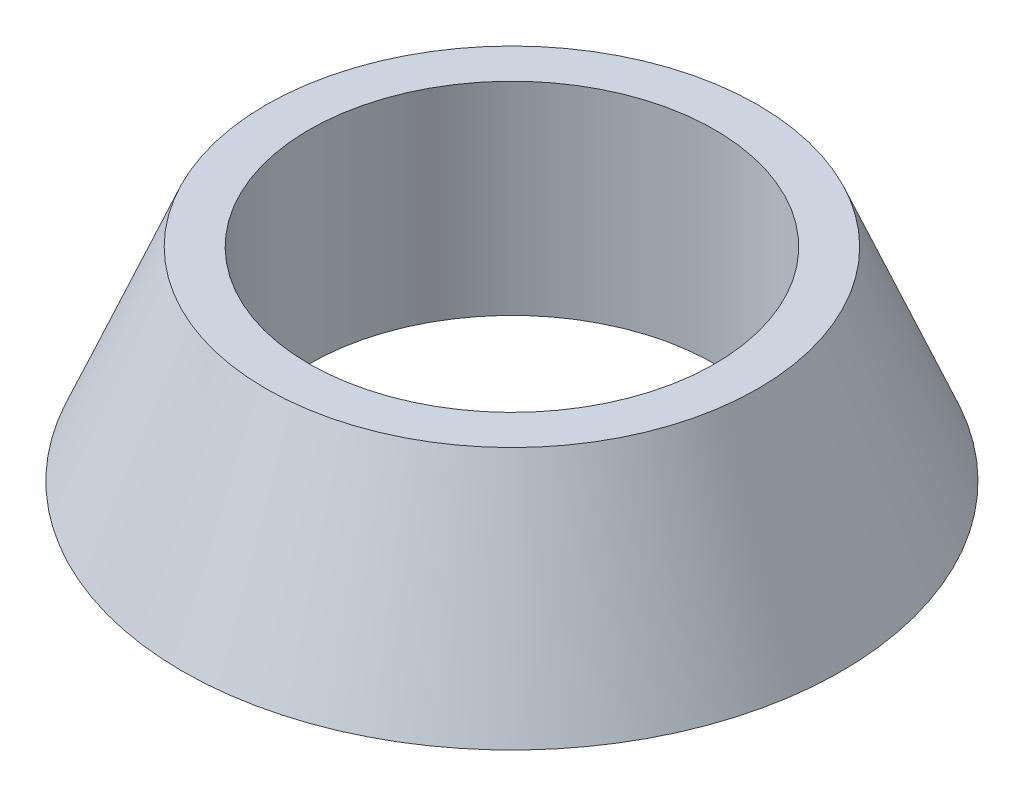
ISO-10303-21;
HEADER;
FILE_DESCRIPTION(('STEP AP214'),'2;1');
FILE_NAME('part.step','',(''),(''),'','','');
FILE_SCHEMA(('AUTOMOTIVE_DESIGN { 1 0 10303 214 1 1 1 1 }'));
ENDSEC;
DATA;
#1=APPLICATION_CONTEXT('core data for automotive mechanical design processes');
#2=APPLICATION_PROTOCOL_DEFINITION('international standard','automotive_design',2000,#1);
#3=PRODUCT_CONTEXT('',#1,'mechanical');
#4=PRODUCT('Part','Part','',(#3));
#5=PRODUCT_RELATED_PRODUCT_CATEGORY('part','',(#4));
#6=PRODUCT_DEFINITION_FORMATION('','',#4);
#7=PRODUCT_DEFINITION_CONTEXT('part definition',#1,'design');
#8=PRODUCT_DEFINITION('design','',#6,#7);
#9=PRODUCT_DEFINITION_SHAPE('','',#8);
#10=(LENGTH_UNIT() NAMED_UNIT(*) SI_UNIT(.MILLI.,.METRE.));
#11=(NAMED_UNIT(*) PLANE_ANGLE_UNIT() SI_UNIT($,.RADIAN.));
#12=(NAMED_UNIT(*) SI_UNIT($,.STERADIAN.) SOLID_ANGLE_UNIT());
#13=UNCERTAINTY_MEASURE_WITH_UNIT(LENGTH_MEASURE(1.E-05),#10,'distance_accuracy_value','');
#14=(GEOMETRIC_REPRESENTATION_CONTEXT(3) GLOBAL_UNCERTAINTY_ASSIGNED_CONTEXT((#13)) GLOBAL_UNIT_ASSIGNED_CONTEXT((#10,
#11,#12)) REPRESENTATION_CONTEXT('',''));
#15=CARTESIAN_POINT('',(0.,0.,0.));
#16=DIRECTION('',(0.,0.,1.));
#17=DIRECTION('',(1.,0.,0.));
#18=AXIS2_PLACEMENT_3D('',#15,#16,#17);
#19=CARTESIAN_POINT('',(9.7,4.,0.));
#20=DIRECTION('',(0.,-1.,0.));
#21=DIRECTION('',(0.,0.,-1.));
#22=AXIS2_PLACEMENT_3D('',#19,#20,#21);
#23=PLANE('',#22);
#24=CARTESIAN_POINT('',(0.,4.,0.));
#25=DIRECTION('',(0.,1.,0.));
#26=DIRECTION('',(0.,0.,1.));
#27=AXIS2_PLACEMENT_3D('',#24,#25,#26);
#28=CIRCLE('',#27,8.);
#29=CARTESIAN_POINT('',(0.,4.,8.));
#30=VERTEX_POINT('',#29);
#31=EDGE_CURVE('E10',#30,#30,#28,.T.);
#32=ORIENTED_EDGE('',*,*,#31,.F.);
#33=EDGE_LOOP('',(#32));
#34=FACE_BOUND('',#33,.T.);
#35=CARTESIAN_POINT('',(0.,4.,0.));
#36=DIRECTION('',(0.,1.,0.));
#37=DIRECTION('',(0.,0.,1.));
#38=AXIS2_PLACEMENT_3D('',#35,#36,#37);
#39=CIRCLE('',#38,9.7);
#40=CARTESIAN_POINT('',(0.,4.,9.7));
#41=VERTEX_POINT('',#40);
#42=EDGE_CURVE('E47',#41,#41,#39,.T.);
#43=ORIENTED_EDGE('',*,*,#42,.T.);
#44=EDGE_LOOP('',(#43));
#45=FACE_BOUND('',#44,.T.);
#46=ADVANCED_FACE('F33',(#34,#45),#23,.F.);
#47=CARTESIAN_POINT('',(0.,7.92070823611316,0.));
#48=DIRECTION('',(0.,1.,0.));
#49=DIRECTION('',(0.,0.,1.));
#50=AXIS2_PLACEMENT_3D('',#47,#48,#49);
#51=CYLINDRICAL_SURFACE('',#50,8.);
#52=CARTESIAN_POINT('',(0.,-4.,0.));
#53=DIRECTION('',(0.,1.,0.));
#54=DIRECTION('',(0.,0.,1.));
#55=AXIS2_PLACEMENT_3D('',#52,#53,#54);
#56=CIRCLE('',#55,8.);
#57=CARTESIAN_POINT('',(0.,-4.,8.));
#58=VERTEX_POINT('',#57);
#59=EDGE_CURVE('E39',#58,#58,#56,.T.);
#60=ORIENTED_EDGE('',*,*,#59,.F.);
#61=EDGE_LOOP('',(#60));
#62=FACE_BOUND('',#61,.T.);
#63=ORIENTED_EDGE('',*,*,#31,.T.);
#64=EDGE_LOOP('',(#63));
#65=FACE_BOUND('',#64,.T.);
#66=ADVANCED_FACE('F62',(#62,#65),#51,.F.);
#67=CARTESIAN_POINT('',(8.,-4.,0.));
#68=DIRECTION('',(0.,1.,0.));
#69=DIRECTION('',(0.,0.,1.));
#70=AXIS2_PLACEMENT_3D('',#67,#68,#69);
#71=PLANE('',#70);
#72=CARTESIAN_POINT('',(0.,-4.,0.));
#73=DIRECTION('',(0.,1.,0.));
#74=DIRECTION('',(0.,0.,1.));
#75=AXIS2_PLACEMENT_3D('',#72,#73,#74);
#76=CIRCLE('',#75,13.);
#77=CARTESIAN_POINT('',(0.,-4.,13.));
#78=VERTEX_POINT('',#77);
#79=EDGE_CURVE('E43',#78,#78,#76,.T.);
#80=ORIENTED_EDGE('',*,*,#79,.F.);
#81=EDGE_LOOP('',(#80));
#82=FACE_BOUND('',#81,.T.);
#83=ORIENTED_EDGE('',*,*,#59,.T.);
#84=EDGE_LOOP('',(#83));
#85=FACE_BOUND('',#84,.T.);
#86=ADVANCED_FACE('F57',(#82,#85),#71,.F.);
#87=CARTESIAN_POINT('',(0.,-4.,0.));
#88=DIRECTION('',(0.,-1.,0.));
#89=DIRECTION('',(0.,0.,-1.));
#90=AXIS2_PLACEMENT_3D('',#87,#88,#89);
#91=CONICAL_SURFACE('',#90,13.,0.391235579127174);
#92=ORIENTED_EDGE('',*,*,#42,.F.);
#93=EDGE_LOOP('',(#92));
#94=FACE_BOUND('',#93,.T.);
#95=ORIENTED_EDGE('',*,*,#79,.T.);
#96=EDGE_LOOP('',(#95));
#97=FACE_BOUND('',#96,.T.);
#98=ADVANCED_FACE('F54',(#94,#97),#91,.T.);
#99=CLOSED_SHELL('',(#46,#66,#86,#98));
#100=MANIFOLD_SOLID_BREP('B2',#99);
#101=ADVANCED_BREP_SHAPE_REPRESENTATION('',(#18,#100),#14);
#102=SHAPE_DEFINITION_REPRESENTATION(#9,#101);
ENDSEC;
END-ISO-10303-21;
